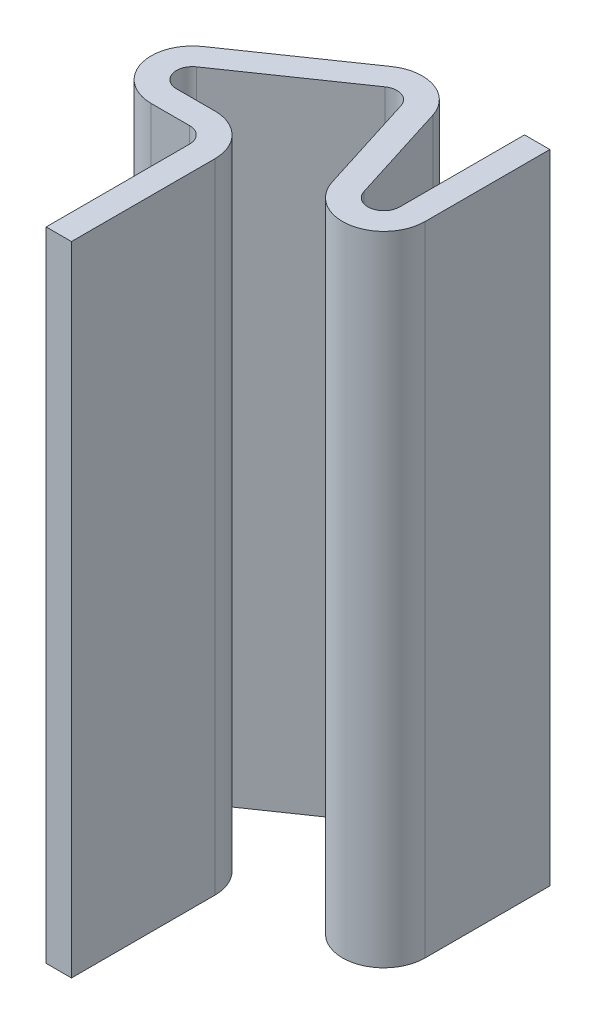
ISO-10303-21;
HEADER;
FILE_DESCRIPTION(('STEP AP214'),'2;1');
FILE_NAME('part.step','',(''),(''),'','','');
FILE_SCHEMA(('AUTOMOTIVE_DESIGN { 1 0 10303 214 1 1 1 1 }'));
ENDSEC;
DATA;
#1=APPLICATION_CONTEXT('core data for automotive mechanical design processes');
#2=APPLICATION_PROTOCOL_DEFINITION('international standard','automotive_design',2000,#1);
#3=PRODUCT_CONTEXT('',#1,'mechanical');
#4=PRODUCT('Part','Part','',(#3));
#5=PRODUCT_RELATED_PRODUCT_CATEGORY('part','',(#4));
#6=PRODUCT_DEFINITION_FORMATION('','',#4);
#7=PRODUCT_DEFINITION_CONTEXT('part definition',#1,'design');
#8=PRODUCT_DEFINITION('design','',#6,#7);
#9=PRODUCT_DEFINITION_SHAPE('','',#8);
#10=(LENGTH_UNIT() NAMED_UNIT(*) SI_UNIT(.MILLI.,.METRE.));
#11=(NAMED_UNIT(*) PLANE_ANGLE_UNIT() SI_UNIT($,.RADIAN.));
#12=(NAMED_UNIT(*) SI_UNIT($,.STERADIAN.) SOLID_ANGLE_UNIT());
#13=UNCERTAINTY_MEASURE_WITH_UNIT(LENGTH_MEASURE(1.E-05),#10,'distance_accuracy_value','');
#14=(GEOMETRIC_REPRESENTATION_CONTEXT(3) GLOBAL_UNCERTAINTY_ASSIGNED_CONTEXT((#13)) GLOBAL_UNIT_ASSIGNED_CONTEXT((#10,
#11,#12)) REPRESENTATION_CONTEXT('',''));
#15=CARTESIAN_POINT('',(0.,0.,0.));
#16=DIRECTION('',(0.,0.,1.));
#17=DIRECTION('',(1.,0.,0.));
#18=AXIS2_PLACEMENT_3D('',#15,#16,#17);
#19=CARTESIAN_POINT('',(0.,10.,0.));
#20=DIRECTION('',(0.,-1.,0.));
#21=DIRECTION('',(0.,0.,-1.));
#22=AXIS2_PLACEMENT_3D('',#19,#20,#21);
#23=CYLINDRICAL_SURFACE('',#22,1.29375);
#24=CARTESIAN_POINT('',(0.,-10.,0.));
#25=DIRECTION('',(0.,1.,0.));
#26=DIRECTION('',(0.,0.,1.));
#27=AXIS2_PLACEMENT_3D('',#24,#25,#26);
#28=CIRCLE('',#27,1.29375);
#29=CARTESIAN_POINT('',(1.29375,-10.,0.));
#30=VERTEX_POINT('',#29);
#31=CARTESIAN_POINT('',(0.,-10.,-1.29375));
#32=VERTEX_POINT('',#31);
#33=EDGE_CURVE('E201',#30,#32,#28,.T.);
#34=ORIENTED_EDGE('',*,*,#33,.T.);
#35=DIRECTION('',(0.,-1.,0.));
#36=VECTOR('',#35,1.);
#37=CARTESIAN_POINT('',(0.,10.,-1.29375));
#38=LINE('',#37,#36);
#39=CARTESIAN_POINT('',(0.,10.,-1.29375));
#40=VERTEX_POINT('',#39);
#41=EDGE_CURVE('E11',#40,#32,#38,.T.);
#42=ORIENTED_EDGE('',*,*,#41,.F.);
#43=CARTESIAN_POINT('',(0.,10.,0.));
#44=DIRECTION('',(0.,1.,0.));
#45=DIRECTION('',(0.,0.,1.));
#46=AXIS2_PLACEMENT_3D('',#43,#44,#45);
#47=CIRCLE('',#46,1.29375);
#48=CARTESIAN_POINT('',(1.29375,10.,0.));
#49=VERTEX_POINT('',#48);
#50=EDGE_CURVE('E239',#49,#40,#47,.T.);
#51=ORIENTED_EDGE('',*,*,#50,.F.);
#52=DIRECTION('',(0.,-1.,0.));
#53=VECTOR('',#52,1.);
#54=CARTESIAN_POINT('',(1.29375,10.,0.));
#55=LINE('',#54,#53);
#56=EDGE_CURVE('E197',#49,#30,#55,.T.);
#57=ORIENTED_EDGE('',*,*,#56,.T.);
#58=EDGE_LOOP('',(#34,#42,#51,#57));
#59=FACE_BOUND('',#58,.T.);
#60=ADVANCED_FACE('F33',(#59),#23,.T.);
#61=CARTESIAN_POINT('',(0.,10.,-1.29375));
#62=DIRECTION('',(0.,0.,1.));
#63=DIRECTION('',(1.,0.,0.));
#64=AXIS2_PLACEMENT_3D('',#61,#62,#63);
#65=PLANE('',#64);
#66=DIRECTION('',(-1.,0.,0.));
#67=VECTOR('',#66,1.);
#68=CARTESIAN_POINT('',(0.,-10.,-1.29375));
#69=LINE('',#68,#67);
#70=CARTESIAN_POINT('',(-1.20625,-10.,-1.29375));
#71=VERTEX_POINT('',#70);
#72=EDGE_CURVE('E204',#32,#71,#69,.T.);
#73=ORIENTED_EDGE('',*,*,#72,.T.);
#74=DIRECTION('',(0.,-1.,0.));
#75=VECTOR('',#74,1.);
#76=CARTESIAN_POINT('',(-1.20625,10.,-1.29375));
#77=LINE('',#76,#75);
#78=CARTESIAN_POINT('',(-1.20625,10.,-1.29375));
#79=VERTEX_POINT('',#78);
#80=EDGE_CURVE('E41',#79,#71,#77,.T.);
#81=ORIENTED_EDGE('',*,*,#80,.F.);
#82=DIRECTION('',(-1.,0.,0.));
#83=VECTOR('',#82,1.);
#84=CARTESIAN_POINT('',(0.,10.,-1.29375));
#85=LINE('',#84,#83);
#86=EDGE_CURVE('E128',#40,#79,#85,.T.);
#87=ORIENTED_EDGE('',*,*,#86,.F.);
#88=ORIENTED_EDGE('',*,*,#41,.T.);
#89=EDGE_LOOP('',(#73,#81,#87,#88));
#90=FACE_BOUND('',#89,.T.);
#91=ADVANCED_FACE('F357',(#90),#65,.F.);
#92=CARTESIAN_POINT('',(-1.20625,10.,-1.79375));
#93=DIRECTION('',(0.,-1.,0.));
#94=DIRECTION('',(0.,0.,-1.));
#95=AXIS2_PLACEMENT_3D('',#92,#93,#94);
#96=CYLINDRICAL_SURFACE('',#95,0.5);
#97=CARTESIAN_POINT('',(-1.20625,-10.,-1.79375));
#98=DIRECTION('',(0.,-1.,0.));
#99=DIRECTION('',(0.,0.,-1.));
#100=AXIS2_PLACEMENT_3D('',#97,#98,#99);
#101=CIRCLE('',#100,0.5);
#102=CARTESIAN_POINT('',(-1.49001339561737,-10.,-2.20542746514438));
#103=VERTEX_POINT('',#102);
#104=EDGE_CURVE('E206',#71,#103,#101,.T.);
#105=ORIENTED_EDGE('',*,*,#104,.T.);
#106=DIRECTION('',(0.,-1.,0.));
#107=VECTOR('',#106,1.);
#108=CARTESIAN_POINT('',(-1.49001339561737,10.,-2.20542746514438));
#109=LINE('',#108,#107);
#110=CARTESIAN_POINT('',(-1.49001339561737,10.,-2.20542746514438));
#111=VERTEX_POINT('',#110);
#112=EDGE_CURVE('E282',#111,#103,#109,.T.);
#113=ORIENTED_EDGE('',*,*,#112,.F.);
#114=CARTESIAN_POINT('',(-1.20625,10.,-1.79375));
#115=DIRECTION('',(0.,-1.,0.));
#116=DIRECTION('',(0.,0.,-1.));
#117=AXIS2_PLACEMENT_3D('',#114,#115,#116);
#118=CIRCLE('',#117,0.5);
#119=EDGE_CURVE('E290',#79,#111,#118,.T.);
#120=ORIENTED_EDGE('',*,*,#119,.F.);
#121=ORIENTED_EDGE('',*,*,#80,.T.);
#122=EDGE_LOOP('',(#105,#113,#120,#121));
#123=FACE_BOUND('',#122,.T.);
#124=ADVANCED_FACE('F288',(#123),#96,.F.);
#125=CARTESIAN_POINT('',(-1.49001339561737,10.,-2.20542746514438));
#126=DIRECTION('',(-0.567526791234746,0.,-0.82335493028875));
#127=DIRECTION('',(-0.82335493028875,0.,0.567526791234746));
#128=AXIS2_PLACEMENT_3D('',#125,#126,#127);
#129=PLANE('',#128);
#130=DIRECTION('',(0.82335493028875,0.,-0.567526791234746));
#131=VECTOR('',#130,1.);
#132=CARTESIAN_POINT('',(-1.49001339561737,-10.,-2.20542746514438));
#133=LINE('',#132,#131);
#134=CARTESIAN_POINT('',(2.00998660438263,-10.,-4.61792746514438));
#135=VERTEX_POINT('',#134);
#136=EDGE_CURVE('E208',#103,#135,#133,.T.);
#137=ORIENTED_EDGE('',*,*,#136,.T.);
#138=DIRECTION('',(0.,-1.,0.));
#139=VECTOR('',#138,1.);
#140=CARTESIAN_POINT('',(2.00998660438263,10.,-4.61792746514438));
#141=LINE('',#140,#139);
#142=CARTESIAN_POINT('',(2.00998660438263,10.,-4.61792746514438));
#143=VERTEX_POINT('',#142);
#144=EDGE_CURVE('E279',#143,#135,#141,.T.);
#145=ORIENTED_EDGE('',*,*,#144,.F.);
#146=DIRECTION('',(0.82335493028875,0.,-0.567526791234746));
#147=VECTOR('',#146,1.);
#148=CARTESIAN_POINT('',(-1.49001339561737,10.,-2.20542746514438));
#149=LINE('',#148,#147);
#150=EDGE_CURVE('E308',#111,#143,#149,.T.);
#151=ORIENTED_EDGE('',*,*,#150,.F.);
#152=ORIENTED_EDGE('',*,*,#112,.T.);
#153=EDGE_LOOP('',(#137,#145,#151,#152));
#154=FACE_BOUND('',#153,.T.);
#155=ADVANCED_FACE('F299',(#154),#129,.F.);
#156=CARTESIAN_POINT('',(2.29375,10.,-4.20625));
#157=DIRECTION('',(0.,-1.,0.));
#158=DIRECTION('',(0.,0.,-1.));
#159=AXIS2_PLACEMENT_3D('',#156,#157,#158);
#160=CYLINDRICAL_SURFACE('',#159,0.500000000000001);
#161=CARTESIAN_POINT('',(2.29375,-10.,-4.20625));
#162=DIRECTION('',(0.,-1.,0.));
#163=DIRECTION('',(0.,0.,-1.));
#164=AXIS2_PLACEMENT_3D('',#161,#162,#163);
#165=CIRCLE('',#164,0.500000000000001);
#166=CARTESIAN_POINT('',(2.77058189966681,-10.,-4.35668716116752));
#167=VERTEX_POINT('',#166);
#168=EDGE_CURVE('E210',#135,#167,#165,.T.);
#169=ORIENTED_EDGE('',*,*,#168,.T.);
#170=DIRECTION('',(0.,-1.,0.));
#171=VECTOR('',#170,1.);
#172=CARTESIAN_POINT('',(2.77058189966681,10.,-4.35668716116752));
#173=LINE('',#172,#171);
#174=CARTESIAN_POINT('',(2.77058189966681,10.,-4.35668716116752));
#175=VERTEX_POINT('',#174);
#176=EDGE_CURVE('E276',#175,#167,#173,.T.);
#177=ORIENTED_EDGE('',*,*,#176,.F.);
#178=CARTESIAN_POINT('',(2.29375,10.,-4.20625));
#179=DIRECTION('',(0.,-1.,0.));
#180=DIRECTION('',(0.,0.,-1.));
#181=AXIS2_PLACEMENT_3D('',#178,#179,#180);
#182=CIRCLE('',#181,0.500000000000001);
#183=EDGE_CURVE('E305',#143,#175,#182,.T.);
#184=ORIENTED_EDGE('',*,*,#183,.F.);
#185=ORIENTED_EDGE('',*,*,#144,.T.);
#186=EDGE_LOOP('',(#169,#177,#184,#185));
#187=FACE_BOUND('',#186,.T.);
#188=ADVANCED_FACE('F303',(#187),#160,.F.);
#189=CARTESIAN_POINT('',(2.77058189966681,10.,-4.35668716116752));
#190=DIRECTION('',(0.953663799333616,0.,-0.300874322335046));
#191=DIRECTION('',(-0.300874322335046,0.,-0.953663799333616));
#192=AXIS2_PLACEMENT_3D('',#189,#190,#191);
#193=PLANE('',#192);
#194=DIRECTION('',(0.300874322335046,0.,0.953663799333616));
#195=VECTOR('',#194,1.);
#196=CARTESIAN_POINT('',(2.77058189966681,-10.,-4.35668716116752));
#197=LINE('',#196,#195);
#198=CARTESIAN_POINT('',(3.76704888615141,-10.,-1.19824384547904));
#199=VERTEX_POINT('',#198);
#200=EDGE_CURVE('E212',#167,#199,#197,.T.);
#201=ORIENTED_EDGE('',*,*,#200,.T.);
#202=DIRECTION('',(0.,-1.,0.));
#203=VECTOR('',#202,1.);
#204=CARTESIAN_POINT('',(3.76704888615141,10.,-1.19824384547904));
#205=LINE('',#204,#203);
#206=CARTESIAN_POINT('',(3.76704888615141,10.,-1.19824384547904));
#207=VERTEX_POINT('',#206);
#208=EDGE_CURVE('E273',#207,#199,#205,.T.);
#209=ORIENTED_EDGE('',*,*,#208,.F.);
#210=DIRECTION('',(0.300874322335046,0.,0.953663799333616));
#211=VECTOR('',#210,1.);
#212=CARTESIAN_POINT('',(2.77058189966681,10.,-4.35668716116752));
#213=LINE('',#212,#211);
#214=EDGE_CURVE('E307',#175,#207,#213,.T.);
#215=ORIENTED_EDGE('',*,*,#214,.F.);
#216=ORIENTED_EDGE('',*,*,#176,.T.);
#217=EDGE_LOOP('',(#201,#209,#215,#216));
#218=FACE_BOUND('',#217,.T.);
#219=ADVANCED_FACE('F370',(#218),#193,.F.);
#220=CARTESIAN_POINT('',(5.00085142653927,10.,-1.5875));
#221=DIRECTION('',(0.,-1.,0.));
#222=DIRECTION('',(0.,0.,-1.));
#223=AXIS2_PLACEMENT_3D('',#220,#221,#222);
#224=CYLINDRICAL_SURFACE('',#223,1.29375);
#225=CARTESIAN_POINT('',(5.00085142653927,-10.,-1.5875));
#226=DIRECTION('',(0.,1.,0.));
#227=DIRECTION('',(0.,0.,1.));
#228=AXIS2_PLACEMENT_3D('',#225,#226,#227);
#229=CIRCLE('',#228,1.29375);
#230=CARTESIAN_POINT('',(6.29460142653927,-10.,-1.5875));
#231=VERTEX_POINT('',#230);
#232=EDGE_CURVE('E214',#199,#231,#229,.T.);
#233=ORIENTED_EDGE('',*,*,#232,.T.);
#234=DIRECTION('',(0.,-1.,0.));
#235=VECTOR('',#234,1.);
#236=CARTESIAN_POINT('',(6.29460142653927,10.,-1.5875));
#237=LINE('',#236,#235);
#238=CARTESIAN_POINT('',(6.29460142653927,10.,-1.5875));
#239=VERTEX_POINT('',#238);
#240=EDGE_CURVE('E270',#239,#231,#237,.T.);
#241=ORIENTED_EDGE('',*,*,#240,.F.);
#242=CARTESIAN_POINT('',(5.00085142653927,10.,-1.5875));
#243=DIRECTION('',(0.,1.,0.));
#244=DIRECTION('',(0.,0.,1.));
#245=AXIS2_PLACEMENT_3D('',#242,#243,#244);
#246=CIRCLE('',#245,1.29375);
#247=EDGE_CURVE('E310',#207,#239,#246,.T.);
#248=ORIENTED_EDGE('',*,*,#247,.F.);
#249=ORIENTED_EDGE('',*,*,#208,.T.);
#250=EDGE_LOOP('',(#233,#241,#248,#249));
#251=FACE_BOUND('',#250,.T.);
#252=ADVANCED_FACE('F373',(#251),#224,.T.);
#253=CARTESIAN_POINT('',(6.29460142653927,10.,-1.5875));
#254=DIRECTION('',(-1.,0.,0.));
#255=DIRECTION('',(0.,0.,1.));
#256=AXIS2_PLACEMENT_3D('',#253,#254,#255);
#257=PLANE('',#256);
#258=DIRECTION('',(0.,0.,-1.));
#259=VECTOR('',#258,1.);
#260=CARTESIAN_POINT('',(6.29460142653927,-10.,-1.5875));
#261=LINE('',#260,#259);
#262=CARTESIAN_POINT('',(6.29460142653928,-10.,-5.5));
#263=VERTEX_POINT('',#262);
#264=EDGE_CURVE('E216',#231,#263,#261,.T.);
#265=ORIENTED_EDGE('',*,*,#264,.T.);
#266=DIRECTION('',(0.,-1.,0.));
#267=VECTOR('',#266,1.);
#268=CARTESIAN_POINT('',(6.29460142653928,10.,-5.5));
#269=LINE('',#268,#267);
#270=CARTESIAN_POINT('',(6.29460142653928,10.,-5.5));
#271=VERTEX_POINT('',#270);
#272=EDGE_CURVE('E267',#271,#263,#269,.T.);
#273=ORIENTED_EDGE('',*,*,#272,.F.);
#274=DIRECTION('',(0.,0.,-1.));
#275=VECTOR('',#274,1.);
#276=CARTESIAN_POINT('',(6.29460142653927,10.,-1.5875));
#277=LINE('',#276,#275);
#278=EDGE_CURVE('E316',#239,#271,#277,.T.);
#279=ORIENTED_EDGE('',*,*,#278,.F.);
#280=ORIENTED_EDGE('',*,*,#240,.T.);
#281=EDGE_LOOP('',(#265,#273,#279,#280));
#282=FACE_BOUND('',#281,.T.);
#283=ADVANCED_FACE('F377',(#282),#257,.F.);
#284=CARTESIAN_POINT('',(5.50085142653927,10.,-5.5));
#285=DIRECTION('',(0.,0.,1.));
#286=DIRECTION('',(1.,0.,0.));
#287=AXIS2_PLACEMENT_3D('',#284,#285,#286);
#288=PLANE('',#287);
#289=DIRECTION('',(-1.,0.,0.));
#290=VECTOR('',#289,1.);
#291=CARTESIAN_POINT('',(5.50085142653927,-10.,-5.5));
#292=LINE('',#291,#290);
#293=CARTESIAN_POINT('',(5.50085142653927,-10.,-5.5));
#294=VERTEX_POINT('',#293);
#295=EDGE_CURVE('E218',#263,#294,#292,.T.);
#296=ORIENTED_EDGE('',*,*,#295,.T.);
#297=DIRECTION('',(0.,-1.,0.));
#298=VECTOR('',#297,1.);
#299=CARTESIAN_POINT('',(5.50085142653927,10.,-5.5));
#300=LINE('',#299,#298);
#301=CARTESIAN_POINT('',(5.50085142653927,10.,-5.5));
#302=VERTEX_POINT('',#301);
#303=EDGE_CURVE('E264',#302,#294,#300,.T.);
#304=ORIENTED_EDGE('',*,*,#303,.F.);
#305=DIRECTION('',(-1.,0.,0.));
#306=VECTOR('',#305,1.);
#307=CARTESIAN_POINT('',(5.50085142653927,10.,-5.5));
#308=LINE('',#307,#306);
#309=EDGE_CURVE('E318',#271,#302,#308,.T.);
#310=ORIENTED_EDGE('',*,*,#309,.F.);
#311=ORIENTED_EDGE('',*,*,#272,.T.);
#312=EDGE_LOOP('',(#296,#304,#310,#311));
#313=FACE_BOUND('',#312,.T.);
#314=ADVANCED_FACE('F381',(#313),#288,.F.);
#315=CARTESIAN_POINT('',(5.50085142653927,10.,-1.5875));
#316=DIRECTION('',(1.,0.,0.));
#317=DIRECTION('',(0.,0.,-1.));
#318=AXIS2_PLACEMENT_3D('',#315,#316,#317);
#319=PLANE('',#318);
#320=DIRECTION('',(0.,0.,1.));
#321=VECTOR('',#320,1.);
#322=CARTESIAN_POINT('',(5.50085142653927,-10.,-1.5875));
#323=LINE('',#322,#321);
#324=CARTESIAN_POINT('',(5.50085142653927,-10.,-1.5875));
#325=VERTEX_POINT('',#324);
#326=EDGE_CURVE('E220',#294,#325,#323,.T.);
#327=ORIENTED_EDGE('',*,*,#326,.T.);
#328=DIRECTION('',(0.,-1.,0.));
#329=VECTOR('',#328,1.);
#330=CARTESIAN_POINT('',(5.50085142653927,10.,-1.5875));
#331=LINE('',#330,#329);
#332=CARTESIAN_POINT('',(5.50085142653927,10.,-1.5875));
#333=VERTEX_POINT('',#332);
#334=EDGE_CURVE('E261',#333,#325,#331,.T.);
#335=ORIENTED_EDGE('',*,*,#334,.F.);
#336=DIRECTION('',(0.,0.,1.));
#337=VECTOR('',#336,1.);
#338=CARTESIAN_POINT('',(5.50085142653927,10.,-1.5875));
#339=LINE('',#338,#337);
#340=EDGE_CURVE('E320',#302,#333,#339,.T.);
#341=ORIENTED_EDGE('',*,*,#340,.F.);
#342=ORIENTED_EDGE('',*,*,#303,.T.);
#343=EDGE_LOOP('',(#327,#335,#341,#342));
#344=FACE_BOUND('',#343,.T.);
#345=ADVANCED_FACE('F385',(#344),#319,.F.);
#346=CARTESIAN_POINT('',(5.00085142653927,10.,-1.5875));
#347=DIRECTION('',(0.,-1.,0.));
#348=DIRECTION('',(0.,0.,-1.));
#349=AXIS2_PLACEMENT_3D('',#346,#347,#348);
#350=CYLINDRICAL_SURFACE('',#349,0.500000000000002);
#351=CARTESIAN_POINT('',(5.00085142653927,-10.,-1.5875));
#352=DIRECTION('',(0.,-1.,0.));
#353=DIRECTION('',(0.,0.,1.));
#354=AXIS2_PLACEMENT_3D('',#351,#352,#353);
#355=CIRCLE('',#354,0.500000000000002);
#356=CARTESIAN_POINT('',(4.52401952687246,-10.,-1.43706283883248));
#357=VERTEX_POINT('',#356);
#358=EDGE_CURVE('E222',#325,#357,#355,.T.);
#359=ORIENTED_EDGE('',*,*,#358,.T.);
#360=DIRECTION('',(0.,-1.,0.));
#361=VECTOR('',#360,1.);
#362=CARTESIAN_POINT('',(4.52401952687246,10.,-1.43706283883248));
#363=LINE('',#362,#361);
#364=CARTESIAN_POINT('',(4.52401952687246,10.,-1.43706283883248));
#365=VERTEX_POINT('',#364);
#366=EDGE_CURVE('E258',#365,#357,#363,.T.);
#367=ORIENTED_EDGE('',*,*,#366,.F.);
#368=CARTESIAN_POINT('',(5.00085142653927,10.,-1.5875));
#369=DIRECTION('',(0.,-1.,0.));
#370=DIRECTION('',(0.,0.,1.));
#371=AXIS2_PLACEMENT_3D('',#368,#369,#370);
#372=CIRCLE('',#371,0.500000000000002);
#373=EDGE_CURVE('E322',#333,#365,#372,.T.);
#374=ORIENTED_EDGE('',*,*,#373,.F.);
#375=ORIENTED_EDGE('',*,*,#334,.T.);
#376=EDGE_LOOP('',(#359,#367,#374,#375));
#377=FACE_BOUND('',#376,.T.);
#378=ADVANCED_FACE('F389',(#377),#350,.F.);
#379=CARTESIAN_POINT('',(3.52755254038787,10.,-4.59550615452097));
#380=DIRECTION('',(-0.953663799333617,0.,0.300874322335043));
#381=DIRECTION('',(0.300874322335043,0.,0.953663799333617));
#382=AXIS2_PLACEMENT_3D('',#379,#380,#381);
#383=PLANE('',#382);
#384=DIRECTION('',(-0.300874322335043,0.,-0.953663799333616));
#385=VECTOR('',#384,1.);
#386=CARTESIAN_POINT('',(3.52755254038787,-10.,-4.59550615452097));
#387=LINE('',#386,#385);
#388=CARTESIAN_POINT('',(3.52755254038787,-10.,-4.59550615452097));
#389=VERTEX_POINT('',#388);
#390=EDGE_CURVE('E224',#357,#389,#387,.T.);
#391=ORIENTED_EDGE('',*,*,#390,.T.);
#392=DIRECTION('',(0.,-1.,0.));
#393=VECTOR('',#392,1.);
#394=CARTESIAN_POINT('',(3.52755254038787,10.,-4.59550615452097));
#395=LINE('',#394,#393);
#396=CARTESIAN_POINT('',(3.52755254038787,10.,-4.59550615452097));
#397=VERTEX_POINT('',#396);
#398=EDGE_CURVE('E255',#397,#389,#395,.T.);
#399=ORIENTED_EDGE('',*,*,#398,.F.);
#400=DIRECTION('',(-0.300874322335043,0.,-0.953663799333616));
#401=VECTOR('',#400,1.);
#402=CARTESIAN_POINT('',(3.52755254038787,10.,-4.59550615452097));
#403=LINE('',#402,#401);
#404=EDGE_CURVE('E324',#365,#397,#403,.T.);
#405=ORIENTED_EDGE('',*,*,#404,.F.);
#406=ORIENTED_EDGE('',*,*,#366,.T.);
#407=EDGE_LOOP('',(#391,#399,#405,#406));
#408=FACE_BOUND('',#407,.T.);
#409=ADVANCED_FACE('F393',(#408),#383,.F.);
#410=CARTESIAN_POINT('',(2.29375,10.,-4.20625));
#411=DIRECTION('',(0.,-1.,0.));
#412=DIRECTION('',(0.,0.,-1.));
#413=AXIS2_PLACEMENT_3D('',#410,#411,#412);
#414=CYLINDRICAL_SURFACE('',#413,1.29375);
#415=CARTESIAN_POINT('',(2.29375,-10.,-4.20625));
#416=DIRECTION('',(0.,1.,0.));
#417=DIRECTION('',(0.,0.,-1.));
#418=AXIS2_PLACEMENT_3D('',#415,#416,#417);
#419=CIRCLE('',#418,1.29375);
#420=CARTESIAN_POINT('',(1.55951221384005,-10.,-5.27146544106107));
#421=VERTEX_POINT('',#420);
#422=EDGE_CURVE('E226',#389,#421,#419,.T.);
#423=ORIENTED_EDGE('',*,*,#422,.T.);
#424=DIRECTION('',(0.,-1.,0.));
#425=VECTOR('',#424,1.);
#426=CARTESIAN_POINT('',(1.55951221384005,10.,-5.27146544106107));
#427=LINE('',#426,#425);
#428=CARTESIAN_POINT('',(1.55951221384005,10.,-5.27146544106107));
#429=VERTEX_POINT('',#428);
#430=EDGE_CURVE('E252',#429,#421,#427,.T.);
#431=ORIENTED_EDGE('',*,*,#430,.F.);
#432=CARTESIAN_POINT('',(2.29375,10.,-4.20625));
#433=DIRECTION('',(0.,1.,0.));
#434=DIRECTION('',(0.,0.,-1.));
#435=AXIS2_PLACEMENT_3D('',#432,#433,#434);
#436=CIRCLE('',#435,1.29375);
#437=EDGE_CURVE('E326',#397,#429,#436,.T.);
#438=ORIENTED_EDGE('',*,*,#437,.F.);
#439=ORIENTED_EDGE('',*,*,#398,.T.);
#440=EDGE_LOOP('',(#423,#431,#438,#439));
#441=FACE_BOUND('',#440,.T.);
#442=ADVANCED_FACE('F397',(#441),#414,.T.);
#443=CARTESIAN_POINT('',(-1.94048778615995,10.,-2.85896544106107));
#444=DIRECTION('',(0.567526791234746,0.,0.82335493028875));
#445=DIRECTION('',(0.82335493028875,0.,-0.567526791234746));
#446=AXIS2_PLACEMENT_3D('',#443,#444,#445);
#447=PLANE('',#446);
#448=DIRECTION('',(-0.82335493028875,0.,0.567526791234746));
#449=VECTOR('',#448,1.);
#450=CARTESIAN_POINT('',(-1.94048778615995,-10.,-2.85896544106107));
#451=LINE('',#450,#449);
#452=CARTESIAN_POINT('',(-1.94048778615995,-10.,-2.85896544106107));
#453=VERTEX_POINT('',#452);
#454=EDGE_CURVE('E228',#421,#453,#451,.T.);
#455=ORIENTED_EDGE('',*,*,#454,.T.);
#456=DIRECTION('',(0.,-1.,0.));
#457=VECTOR('',#456,1.);
#458=CARTESIAN_POINT('',(-1.94048778615995,10.,-2.85896544106107));
#459=LINE('',#458,#457);
#460=CARTESIAN_POINT('',(-1.94048778615995,10.,-2.85896544106107));
#461=VERTEX_POINT('',#460);
#462=EDGE_CURVE('E249',#461,#453,#459,.T.);
#463=ORIENTED_EDGE('',*,*,#462,.F.);
#464=DIRECTION('',(-0.82335493028875,0.,0.567526791234746));
#465=VECTOR('',#464,1.);
#466=CARTESIAN_POINT('',(-1.94048778615995,10.,-2.85896544106107));
#467=LINE('',#466,#465);
#468=EDGE_CURVE('E328',#429,#461,#467,.T.);
#469=ORIENTED_EDGE('',*,*,#468,.F.);
#470=ORIENTED_EDGE('',*,*,#430,.T.);
#471=EDGE_LOOP('',(#455,#463,#469,#470));
#472=FACE_BOUND('',#471,.T.);
#473=ADVANCED_FACE('F401',(#472),#447,.F.);
#474=CARTESIAN_POINT('',(-1.20625,10.,-1.79375));
#475=DIRECTION('',(0.,-1.,0.));
#476=DIRECTION('',(0.,0.,-1.));
#477=AXIS2_PLACEMENT_3D('',#474,#475,#476);
#478=CYLINDRICAL_SURFACE('',#477,1.29375);
#479=CARTESIAN_POINT('',(-1.20625,-10.,-1.79375));
#480=DIRECTION('',(0.,1.,0.));
#481=DIRECTION('',(0.,0.,-1.));
#482=AXIS2_PLACEMENT_3D('',#479,#480,#481);
#483=CIRCLE('',#482,1.29375);
#484=CARTESIAN_POINT('',(-1.20625,-10.,-0.5));
#485=VERTEX_POINT('',#484);
#486=EDGE_CURVE('E230',#453,#485,#483,.T.);
#487=ORIENTED_EDGE('',*,*,#486,.T.);
#488=DIRECTION('',(0.,-1.,0.));
#489=VECTOR('',#488,1.);
#490=CARTESIAN_POINT('',(-1.20625,10.,-0.5));
#491=LINE('',#490,#489);
#492=CARTESIAN_POINT('',(-1.20625,10.,-0.5));
#493=VERTEX_POINT('',#492);
#494=EDGE_CURVE('E246',#493,#485,#491,.T.);
#495=ORIENTED_EDGE('',*,*,#494,.F.);
#496=CARTESIAN_POINT('',(-1.20625,10.,-1.79375));
#497=DIRECTION('',(0.,1.,0.));
#498=DIRECTION('',(0.,0.,-1.));
#499=AXIS2_PLACEMENT_3D('',#496,#497,#498);
#500=CIRCLE('',#499,1.29375);
#501=EDGE_CURVE('E330',#461,#493,#500,.T.);
#502=ORIENTED_EDGE('',*,*,#501,.F.);
#503=ORIENTED_EDGE('',*,*,#462,.T.);
#504=EDGE_LOOP('',(#487,#495,#502,#503));
#505=FACE_BOUND('',#504,.T.);
#506=ADVANCED_FACE('F405',(#505),#478,.T.);
#507=CARTESIAN_POINT('',(0.,10.,-0.5));
#508=DIRECTION('',(0.,0.,-1.));
#509=DIRECTION('',(-1.,0.,0.));
#510=AXIS2_PLACEMENT_3D('',#507,#508,#509);
#511=PLANE('',#510);
#512=DIRECTION('',(1.,0.,0.));
#513=VECTOR('',#512,1.);
#514=CARTESIAN_POINT('',(0.,-10.,-0.5));
#515=LINE('',#514,#513);
#516=CARTESIAN_POINT('',(0.,-10.,-0.5));
#517=VERTEX_POINT('',#516);
#518=EDGE_CURVE('E232',#485,#517,#515,.T.);
#519=ORIENTED_EDGE('',*,*,#518,.T.);
#520=DIRECTION('',(0.,-1.,0.));
#521=VECTOR('',#520,1.);
#522=CARTESIAN_POINT('',(0.,10.,-0.5));
#523=LINE('',#522,#521);
#524=CARTESIAN_POINT('',(0.,10.,-0.5));
#525=VERTEX_POINT('',#524);
#526=EDGE_CURVE('E243',#525,#517,#523,.T.);
#527=ORIENTED_EDGE('',*,*,#526,.F.);
#528=DIRECTION('',(1.,0.,0.));
#529=VECTOR('',#528,1.);
#530=CARTESIAN_POINT('',(0.,10.,-0.5));
#531=LINE('',#530,#529);
#532=EDGE_CURVE('E332',#493,#525,#531,.T.);
#533=ORIENTED_EDGE('',*,*,#532,.F.);
#534=ORIENTED_EDGE('',*,*,#494,.T.);
#535=EDGE_LOOP('',(#519,#527,#533,#534));
#536=FACE_BOUND('',#535,.T.);
#537=ADVANCED_FACE('F338',(#536),#511,.F.);
#538=CARTESIAN_POINT('',(0.,10.,0.));
#539=DIRECTION('',(0.,-1.,0.));
#540=DIRECTION('',(0.,0.,-1.));
#541=AXIS2_PLACEMENT_3D('',#538,#539,#540);
#542=CYLINDRICAL_SURFACE('',#541,0.5);
#543=CARTESIAN_POINT('',(0.,-10.,0.));
#544=DIRECTION('',(0.,-1.,0.));
#545=DIRECTION('',(0.,0.,1.));
#546=AXIS2_PLACEMENT_3D('',#543,#544,#545);
#547=CIRCLE('',#546,0.5);
#548=CARTESIAN_POINT('',(0.5,-10.,0.));
#549=VERTEX_POINT('',#548);
#550=EDGE_CURVE('E234',#517,#549,#547,.T.);
#551=ORIENTED_EDGE('',*,*,#550,.T.);
#552=DIRECTION('',(0.,-1.,0.));
#553=VECTOR('',#552,1.);
#554=CARTESIAN_POINT('',(0.5,10.,0.));
#555=LINE('',#554,#553);
#556=CARTESIAN_POINT('',(0.5,10.,0.));
#557=VERTEX_POINT('',#556);
#558=EDGE_CURVE('E192',#557,#549,#555,.T.);
#559=ORIENTED_EDGE('',*,*,#558,.F.);
#560=CARTESIAN_POINT('',(0.,10.,0.));
#561=DIRECTION('',(0.,-1.,0.));
#562=DIRECTION('',(0.,0.,1.));
#563=AXIS2_PLACEMENT_3D('',#560,#561,#562);
#564=CIRCLE('',#563,0.5);
#565=EDGE_CURVE('E183',#525,#557,#564,.T.);
#566=ORIENTED_EDGE('',*,*,#565,.F.);
#567=ORIENTED_EDGE('',*,*,#526,.T.);
#568=EDGE_LOOP('',(#551,#559,#566,#567));
#569=FACE_BOUND('',#568,.T.);
#570=ADVANCED_FACE('F342',(#569),#542,.F.);
#571=CARTESIAN_POINT('',(0.5,10.,0.));
#572=DIRECTION('',(1.,0.,0.));
#573=DIRECTION('',(0.,0.,-1.));
#574=AXIS2_PLACEMENT_3D('',#571,#572,#573);
#575=PLANE('',#574);
#576=DIRECTION('',(0.,0.,1.));
#577=VECTOR('',#576,1.);
#578=CARTESIAN_POINT('',(0.5,-10.,0.));
#579=LINE('',#578,#577);
#580=CARTESIAN_POINT('',(0.5,-10.,4.5));
#581=VERTEX_POINT('',#580);
#582=EDGE_CURVE('E191',#549,#581,#579,.T.);
#583=ORIENTED_EDGE('',*,*,#582,.T.);
#584=DIRECTION('',(0.,-1.,0.));
#585=VECTOR('',#584,1.);
#586=CARTESIAN_POINT('',(0.5,10.,4.5));
#587=LINE('',#586,#585);
#588=CARTESIAN_POINT('',(0.5,10.,4.5));
#589=VERTEX_POINT('',#588);
#590=EDGE_CURVE('E188',#589,#581,#587,.T.);
#591=ORIENTED_EDGE('',*,*,#590,.F.);
#592=DIRECTION('',(0.,0.,1.));
#593=VECTOR('',#592,1.);
#594=CARTESIAN_POINT('',(0.5,10.,0.));
#595=LINE('',#594,#593);
#596=EDGE_CURVE('E177',#557,#589,#595,.T.);
#597=ORIENTED_EDGE('',*,*,#596,.F.);
#598=ORIENTED_EDGE('',*,*,#558,.T.);
#599=EDGE_LOOP('',(#583,#591,#597,#598));
#600=FACE_BOUND('',#599,.T.);
#601=ADVANCED_FACE('F189',(#600),#575,.F.);
#602=CARTESIAN_POINT('',(0.5,10.,4.5));
#603=DIRECTION('',(0.,0.,-1.));
#604=DIRECTION('',(-1.,0.,0.));
#605=AXIS2_PLACEMENT_3D('',#602,#603,#604);
#606=PLANE('',#605);
#607=DIRECTION('',(1.,0.,0.));
#608=VECTOR('',#607,1.);
#609=CARTESIAN_POINT('',(0.5,-10.,4.5));
#610=LINE('',#609,#608);
#611=CARTESIAN_POINT('',(1.29375,-10.,4.5));
#612=VERTEX_POINT('',#611);
#613=EDGE_CURVE('E114',#581,#612,#610,.T.);
#614=ORIENTED_EDGE('',*,*,#613,.T.);
#615=DIRECTION('',(0.,-1.,0.));
#616=VECTOR('',#615,1.);
#617=CARTESIAN_POINT('',(1.29375,10.,4.5));
#618=LINE('',#617,#616);
#619=CARTESIAN_POINT('',(1.29375,10.,4.5));
#620=VERTEX_POINT('',#619);
#621=EDGE_CURVE('E193',#620,#612,#618,.T.);
#622=ORIENTED_EDGE('',*,*,#621,.F.);
#623=DIRECTION('',(1.,0.,0.));
#624=VECTOR('',#623,1.);
#625=CARTESIAN_POINT('',(0.5,10.,4.5));
#626=LINE('',#625,#624);
#627=EDGE_CURVE('E181',#589,#620,#626,.T.);
#628=ORIENTED_EDGE('',*,*,#627,.F.);
#629=ORIENTED_EDGE('',*,*,#590,.T.);
#630=EDGE_LOOP('',(#614,#622,#628,#629));
#631=FACE_BOUND('',#630,.T.);
#632=ADVANCED_FACE('F195',(#631),#606,.F.);
#633=CARTESIAN_POINT('',(1.29375,10.,0.));
#634=DIRECTION('',(-1.,0.,0.));
#635=DIRECTION('',(0.,0.,1.));
#636=AXIS2_PLACEMENT_3D('',#633,#634,#635);
#637=PLANE('',#636);
#638=DIRECTION('',(0.,0.,-1.));
#639=VECTOR('',#638,1.);
#640=CARTESIAN_POINT('',(1.29375,-10.,0.));
#641=LINE('',#640,#639);
#642=EDGE_CURVE('E120',#612,#30,#641,.T.);
#643=ORIENTED_EDGE('',*,*,#642,.T.);
#644=ORIENTED_EDGE('',*,*,#56,.F.);
#645=DIRECTION('',(0.,0.,-1.));
#646=VECTOR('',#645,1.);
#647=CARTESIAN_POINT('',(1.29375,10.,0.));
#648=LINE('',#647,#646);
#649=EDGE_CURVE('E49',#620,#49,#648,.T.);
#650=ORIENTED_EDGE('',*,*,#649,.F.);
#651=ORIENTED_EDGE('',*,*,#621,.T.);
#652=EDGE_LOOP('',(#643,#644,#650,#651));
#653=FACE_BOUND('',#652,.T.);
#654=ADVANCED_FACE('F346',(#653),#637,.F.);
#655=CARTESIAN_POINT('',(0.,10.,0.));
#656=DIRECTION('',(0.,1.,0.));
#657=DIRECTION('',(0.,0.,1.));
#658=AXIS2_PLACEMENT_3D('',#655,#656,#657);
#659=PLANE('',#658);
#660=ORIENTED_EDGE('',*,*,#50,.T.);
#661=ORIENTED_EDGE('',*,*,#86,.T.);
#662=ORIENTED_EDGE('',*,*,#119,.T.);
#663=ORIENTED_EDGE('',*,*,#150,.T.);
#664=ORIENTED_EDGE('',*,*,#183,.T.);
#665=ORIENTED_EDGE('',*,*,#214,.T.);
#666=ORIENTED_EDGE('',*,*,#247,.T.);
#667=ORIENTED_EDGE('',*,*,#278,.T.);
#668=ORIENTED_EDGE('',*,*,#309,.T.);
#669=ORIENTED_EDGE('',*,*,#340,.T.);
#670=ORIENTED_EDGE('',*,*,#373,.T.);
#671=ORIENTED_EDGE('',*,*,#404,.T.);
#672=ORIENTED_EDGE('',*,*,#437,.T.);
#673=ORIENTED_EDGE('',*,*,#468,.T.);
#674=ORIENTED_EDGE('',*,*,#501,.T.);
#675=ORIENTED_EDGE('',*,*,#532,.T.);
#676=ORIENTED_EDGE('',*,*,#565,.T.);
#677=ORIENTED_EDGE('',*,*,#596,.T.);
#678=ORIENTED_EDGE('',*,*,#627,.T.);
#679=ORIENTED_EDGE('',*,*,#649,.T.);
#680=EDGE_LOOP('',(#660,#661,#662,#663,#664,#665,#666,#667,#668,#669,#670,#671,#672,#673,#674,
#675,#676,#677,#678,#679));
#681=FACE_BOUND('',#680,.T.);
#682=ADVANCED_FACE('F179',(#681),#659,.T.);
#683=CARTESIAN_POINT('',(0.,-10.,0.));
#684=DIRECTION('',(0.,1.,0.));
#685=DIRECTION('',(0.,0.,1.));
#686=AXIS2_PLACEMENT_3D('',#683,#684,#685);
#687=PLANE('',#686);
#688=ORIENTED_EDGE('',*,*,#33,.F.);
#689=ORIENTED_EDGE('',*,*,#642,.F.);
#690=ORIENTED_EDGE('',*,*,#613,.F.);
#691=ORIENTED_EDGE('',*,*,#582,.F.);
#692=ORIENTED_EDGE('',*,*,#550,.F.);
#693=ORIENTED_EDGE('',*,*,#518,.F.);
#694=ORIENTED_EDGE('',*,*,#486,.F.);
#695=ORIENTED_EDGE('',*,*,#454,.F.);
#696=ORIENTED_EDGE('',*,*,#422,.F.);
#697=ORIENTED_EDGE('',*,*,#390,.F.);
#698=ORIENTED_EDGE('',*,*,#358,.F.);
#699=ORIENTED_EDGE('',*,*,#326,.F.);
#700=ORIENTED_EDGE('',*,*,#295,.F.);
#701=ORIENTED_EDGE('',*,*,#264,.F.);
#702=ORIENTED_EDGE('',*,*,#232,.F.);
#703=ORIENTED_EDGE('',*,*,#200,.F.);
#704=ORIENTED_EDGE('',*,*,#168,.F.);
#705=ORIENTED_EDGE('',*,*,#136,.F.);
#706=ORIENTED_EDGE('',*,*,#104,.F.);
#707=ORIENTED_EDGE('',*,*,#72,.F.);
#708=EDGE_LOOP('',(#688,#689,#690,#691,#692,#693,#694,#695,#696,#697,#698,#699,#700,#701,#702,
#703,#704,#705,#706,#707));
#709=FACE_BOUND('',#708,.T.);
#710=ADVANCED_FACE('F294',(#709),#687,.F.);
#711=CLOSED_SHELL('',(#60,#91,#124,#155,#188,#219,#252,#283,#314,#345,#378,#409,#442,#473,#506,
#537,#570,#601,#632,#654,#682,#710));
#712=MANIFOLD_SOLID_BREP('B2',#711);
#713=ADVANCED_BREP_SHAPE_REPRESENTATION('',(#18,#712),#14);
#714=SHAPE_DEFINITION_REPRESENTATION(#9,#713);
ENDSEC;
END-ISO-10303-21;
